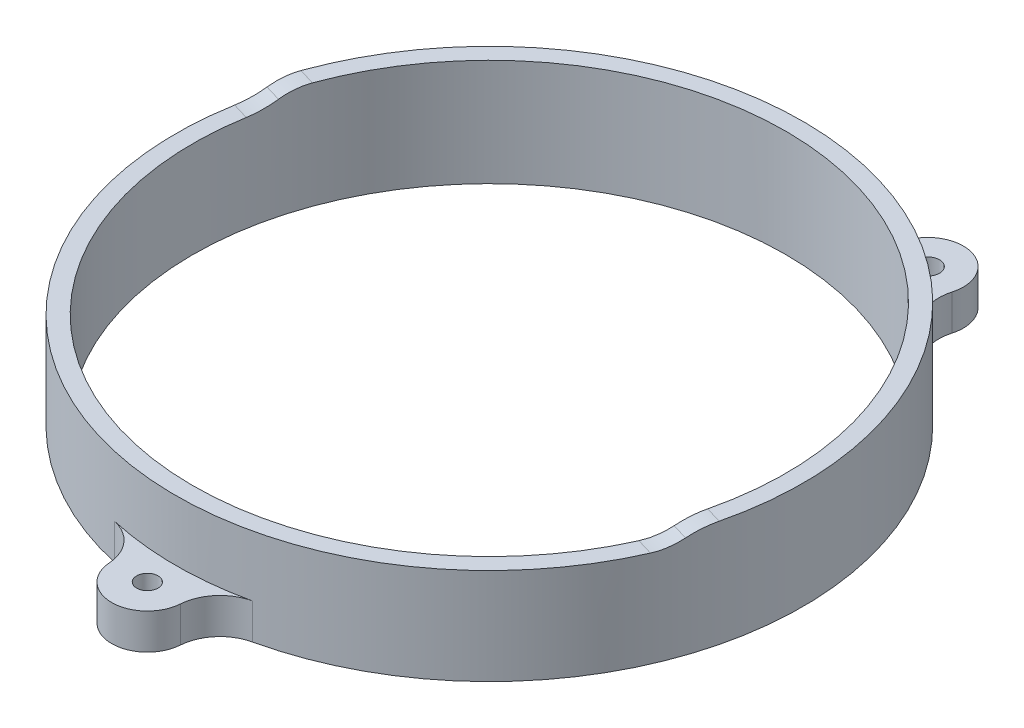
ISO-10303-21;
HEADER;
FILE_DESCRIPTION(('STEP AP214'),'2;1');
FILE_NAME('part.step','',(''),(''),'','','');
FILE_SCHEMA(('AUTOMOTIVE_DESIGN { 1 0 10303 214 1 1 1 1 }'));
ENDSEC;
DATA;
#1=APPLICATION_CONTEXT('core data for automotive mechanical design processes');
#2=APPLICATION_PROTOCOL_DEFINITION('international standard','automotive_design',2000,#1);
#3=PRODUCT_CONTEXT('',#1,'mechanical');
#4=PRODUCT('Part','Part','',(#3));
#5=PRODUCT_RELATED_PRODUCT_CATEGORY('part','',(#4));
#6=PRODUCT_DEFINITION_FORMATION('','',#4);
#7=PRODUCT_DEFINITION_CONTEXT('part definition',#1,'design');
#8=PRODUCT_DEFINITION('design','',#6,#7);
#9=PRODUCT_DEFINITION_SHAPE('','',#8);
#10=(LENGTH_UNIT() NAMED_UNIT(*) SI_UNIT(.MILLI.,.METRE.));
#11=(NAMED_UNIT(*) PLANE_ANGLE_UNIT() SI_UNIT($,.RADIAN.));
#12=(NAMED_UNIT(*) SI_UNIT($,.STERADIAN.) SOLID_ANGLE_UNIT());
#13=UNCERTAINTY_MEASURE_WITH_UNIT(LENGTH_MEASURE(1.E-05),#10,'distance_accuracy_value','');
#14=(GEOMETRIC_REPRESENTATION_CONTEXT(3) GLOBAL_UNCERTAINTY_ASSIGNED_CONTEXT((#13)) GLOBAL_UNIT_ASSIGNED_CONTEXT((#10,
#11,#12)) REPRESENTATION_CONTEXT('',''));
#15=CARTESIAN_POINT('',(0.,0.,0.));
#16=DIRECTION('',(0.,0.,1.));
#17=DIRECTION('',(1.,0.,0.));
#18=AXIS2_PLACEMENT_3D('',#15,#16,#17);
#19=CARTESIAN_POINT('',(0.,15.,0.));
#20=DIRECTION('',(0.,1.,0.));
#21=DIRECTION('',(0.,0.,1.));
#22=AXIS2_PLACEMENT_3D('',#19,#20,#21);
#23=PLANE('',#22);
#24=CARTESIAN_POINT('',(0.,15.,0.));
#25=DIRECTION('',(0.,1.,0.));
#26=DIRECTION('',(0.,0.,1.));
#27=AXIS2_PLACEMENT_3D('',#24,#25,#26);
#28=CIRCLE('',#27,41.6);
#29=CARTESIAN_POINT('',(40.4323625914563,15.,9.78693288385107));
#30=VERTEX_POINT('',#29);
#31=CARTESIAN_POINT('',(-39.0830403842533,15.,-14.2504720736833));
#32=VERTEX_POINT('',#31);
#33=EDGE_CURVE('E209',#30,#32,#28,.T.);
#34=ORIENTED_EDGE('',*,*,#33,.F.);
#35=DIRECTION('',(-0.957218548080887,0.,-0.289365946873363));
#36=VECTOR('',#35,1.);
#37=CARTESIAN_POINT('',(42.7922772191605,15.,10.5003320675119));
#38=LINE('',#37,#36);
#39=CARTESIAN_POINT('',(42.7331060550355,15.,10.4824447000252));
#40=VERTEX_POINT('',#39);
#41=EDGE_CURVE('E614',#30,#40,#38,.F.);
#42=ORIENTED_EDGE('',*,*,#41,.T.);
#43=CARTESIAN_POINT('',(0.,15.,0.));
#44=DIRECTION('',(0.,1.,0.));
#45=DIRECTION('',(0.,0.,1.));
#46=AXIS2_PLACEMENT_3D('',#43,#44,#45);
#47=CIRCLE('',#46,44.);
#48=CARTESIAN_POINT('',(-41.3837838478325,15.,-14.9459838898574));
#49=VERTEX_POINT('',#48);
#50=EDGE_CURVE('E202',#40,#49,#47,.T.);
#51=ORIENTED_EDGE('',*,*,#50,.T.);
#52=DIRECTION('',(-0.957218548080886,0.,-0.289365946873368));
#53=VECTOR('',#52,1.);
#54=CARTESIAN_POINT('',(-39.1456304965634,15.,-14.2693929848481));
#55=LINE('',#54,#53);
#56=EDGE_CURVE('E610',#49,#32,#55,.F.);
#57=ORIENTED_EDGE('',*,*,#56,.T.);
#58=EDGE_LOOP('',(#34,#42,#51,#57));
#59=FACE_BOUND('',#58,.T.);
#60=ADVANCED_FACE('F44',(#59),#23,.T.);
#61=CARTESIAN_POINT('',(0.,0.,0.));
#62=DIRECTION('',(0.,1.,0.));
#63=DIRECTION('',(0.,0.,1.));
#64=AXIS2_PLACEMENT_3D('',#61,#62,#63);
#65=PLANE('',#64);
#66=CARTESIAN_POINT('',(0.,0.,0.));
#67=DIRECTION('',(0.,1.,0.));
#68=DIRECTION('',(0.,0.,1.));
#69=AXIS2_PLACEMENT_3D('',#66,#67,#68);
#70=CIRCLE('',#69,44.);
#71=CARTESIAN_POINT('',(5.6088158517857,0.,-43.6410493084293));
#72=VERTEX_POINT('',#71);
#73=CARTESIAN_POINT('',(-5.60881585178569,0.,-43.6410493084293));
#74=VERTEX_POINT('',#73);
#75=EDGE_CURVE('E203',#72,#74,#70,.T.);
#76=ORIENTED_EDGE('',*,*,#75,.F.);
#77=CARTESIAN_POINT('',(6.3736543770292,0.,-49.5921014868515));
#78=DIRECTION('',(0.,1.,0.));
#79=DIRECTION('',(0.,0.,1.));
#80=AXIS2_PLACEMENT_3D('',#77,#78,#79);
#81=CIRCLE('',#80,6.);
#82=CARTESIAN_POINT('',(11.8518248329944,0.,-47.1447256564181));
#83=VERTEX_POINT('',#82);
#84=EDGE_CURVE('E650',#72,#83,#81,.T.);
#85=ORIENTED_EDGE('',*,*,#84,.T.);
#86=CARTESIAN_POINT('',(16.4169668796321,0.,-45.1052457977236));
#87=DIRECTION('',(0.,-1.,0.));
#88=DIRECTION('',(0.,0.,1.));
#89=AXIS2_PLACEMENT_3D('',#86,#87,#88);
#90=CIRCLE('',#89,5.);
#91=CARTESIAN_POINT('',(21.2250209598818,0.,-43.7331612662918));
#92=VERTEX_POINT('',#91);
#93=EDGE_CURVE('E249',#83,#92,#90,.T.);
#94=ORIENTED_EDGE('',*,*,#93,.T.);
#95=CARTESIAN_POINT('',(26.9946858561814,0.,-42.0866598285737));
#96=DIRECTION('',(0.,1.,0.));
#97=DIRECTION('',(0.,0.,1.));
#98=AXIS2_PLACEMENT_3D('',#95,#96,#97);
#99=CIRCLE('',#98,6.);
#100=CARTESIAN_POINT('',(23.7553235534397,0.,-37.0362606491448));
#101=VERTEX_POINT('',#100);
#102=EDGE_CURVE('E201',#92,#101,#99,.T.);
#103=ORIENTED_EDGE('',*,*,#102,.T.);
#104=CARTESIAN_POINT('',(9.65555507208155,0.,42.9275));
#105=VERTEX_POINT('',#104);
#106=EDGE_CURVE('E188',#105,#101,#70,.T.);
#107=ORIENTED_EDGE('',*,*,#106,.F.);
#108=CARTESIAN_POINT('',(10.9722216728199,0.,48.78125));
#109=DIRECTION('',(0.,1.,0.));
#110=DIRECTION('',(0.,0.,1.));
#111=AXIS2_PLACEMENT_3D('',#108,#109,#110);
#112=CIRCLE('',#111,6.);
#113=CARTESIAN_POINT('',(4.98737348764544,0.,48.3551136363636));
#114=VERTEX_POINT('',#113);
#115=EDGE_CURVE('E170',#105,#114,#112,.T.);
#116=ORIENTED_EDGE('',*,*,#115,.T.);
#117=CARTESIAN_POINT('',(0.,0.,48.));
#118=DIRECTION('',(0.,-1.,0.));
#119=DIRECTION('',(0.,0.,-1.));
#120=AXIS2_PLACEMENT_3D('',#117,#118,#119);
#121=CIRCLE('',#120,5.);
#122=CARTESIAN_POINT('',(-4.98737348764544,0.,48.3551136363636));
#123=VERTEX_POINT('',#122);
#124=EDGE_CURVE('E223',#114,#123,#121,.T.);
#125=ORIENTED_EDGE('',*,*,#124,.T.);
#126=CARTESIAN_POINT('',(-10.9722216728199,0.,48.78125));
#127=DIRECTION('',(0.,1.,0.));
#128=DIRECTION('',(0.,0.,1.));
#129=AXIS2_PLACEMENT_3D('',#126,#127,#128);
#130=CIRCLE('',#129,6.);
#131=CARTESIAN_POINT('',(-9.65555507208155,0.,42.9275));
#132=VERTEX_POINT('',#131);
#133=EDGE_CURVE('E181',#123,#132,#130,.T.);
#134=ORIENTED_EDGE('',*,*,#133,.T.);
#135=CARTESIAN_POINT('',(-23.7553235534396,0.,-37.0362606491448));
#136=VERTEX_POINT('',#135);
#137=EDGE_CURVE('E205',#136,#132,#70,.T.);
#138=ORIENTED_EDGE('',*,*,#137,.F.);
#139=CARTESIAN_POINT('',(-26.9946858561814,0.,-42.0866598285737));
#140=DIRECTION('',(0.,1.,0.));
#141=DIRECTION('',(0.,0.,1.));
#142=AXIS2_PLACEMENT_3D('',#139,#140,#141);
#143=CIRCLE('',#142,6.);
#144=CARTESIAN_POINT('',(-21.2250209598818,0.,-43.7331612662918));
#145=VERTEX_POINT('',#144);
#146=EDGE_CURVE('E655',#136,#145,#143,.T.);
#147=ORIENTED_EDGE('',*,*,#146,.T.);
#148=CARTESIAN_POINT('',(-16.4169668796321,0.,-45.1052457977236));
#149=DIRECTION('',(0.,-1.,0.));
#150=DIRECTION('',(0.,0.,-1.));
#151=AXIS2_PLACEMENT_3D('',#148,#149,#150);
#152=CIRCLE('',#151,5.);
#153=CARTESIAN_POINT('',(-11.8518248329944,0.,-47.1447256564181));
#154=VERTEX_POINT('',#153);
#155=EDGE_CURVE('E237',#145,#154,#152,.T.);
#156=ORIENTED_EDGE('',*,*,#155,.T.);
#157=CARTESIAN_POINT('',(-6.37365437702919,0.,-49.5921014868515));
#158=DIRECTION('',(0.,1.,0.));
#159=DIRECTION('',(0.,0.,1.));
#160=AXIS2_PLACEMENT_3D('',#157,#158,#159);
#161=CIRCLE('',#160,6.);
#162=EDGE_CURVE('E657',#154,#74,#161,.T.);
#163=ORIENTED_EDGE('',*,*,#162,.T.);
#164=EDGE_LOOP('',(#76,#85,#94,#103,#107,#116,#125,#134,#138,#147,#156,#163));
#165=FACE_BOUND('',#164,.T.);
#166=CARTESIAN_POINT('',(0.,0.,0.));
#167=DIRECTION('',(0.,1.,0.));
#168=DIRECTION('',(0.,0.,1.));
#169=AXIS2_PLACEMENT_3D('',#166,#167,#168);
#170=CIRCLE('',#169,41.6);
#171=CARTESIAN_POINT('',(0.,0.,41.6));
#172=VERTEX_POINT('',#171);
#173=EDGE_CURVE('E214',#172,#172,#170,.T.);
#174=ORIENTED_EDGE('',*,*,#173,.T.);
#175=EDGE_LOOP('',(#174));
#176=FACE_BOUND('',#175,.T.);
#177=CARTESIAN_POINT('',(0.,0.,48.));
#178=DIRECTION('',(0.,-1.,0.));
#179=DIRECTION('',(0.,0.,-1.));
#180=AXIS2_PLACEMENT_3D('',#177,#178,#179);
#181=CIRCLE('',#180,1.5);
#182=CARTESIAN_POINT('',(0.,0.,46.5));
#183=VERTEX_POINT('',#182);
#184=EDGE_CURVE('E228',#183,#183,#181,.T.);
#185=ORIENTED_EDGE('',*,*,#184,.F.);
#186=EDGE_LOOP('',(#185));
#187=FACE_BOUND('',#186,.T.);
#188=CARTESIAN_POINT('',(-16.4169668796321,0.,-45.1052457977236));
#189=DIRECTION('',(0.,-1.,0.));
#190=DIRECTION('',(0.,0.,-1.));
#191=AXIS2_PLACEMENT_3D('',#188,#189,#190);
#192=CIRCLE('',#191,1.65);
#193=CARTESIAN_POINT('',(-16.4169668796321,0.,-46.7552457977236));
#194=VERTEX_POINT('',#193);
#195=EDGE_CURVE('E231',#194,#194,#192,.T.);
#196=ORIENTED_EDGE('',*,*,#195,.F.);
#197=EDGE_LOOP('',(#196));
#198=FACE_BOUND('',#197,.T.);
#199=CARTESIAN_POINT('',(16.4169668796321,0.,-45.1052457977236));
#200=DIRECTION('',(0.,-1.,0.));
#201=DIRECTION('',(0.,0.,1.));
#202=AXIS2_PLACEMENT_3D('',#199,#200,#201);
#203=CIRCLE('',#202,1.65);
#204=CARTESIAN_POINT('',(16.4169668796321,0.,-43.4552457977236));
#205=VERTEX_POINT('',#204);
#206=EDGE_CURVE('E243',#205,#205,#203,.T.);
#207=ORIENTED_EDGE('',*,*,#206,.F.);
#208=EDGE_LOOP('',(#207));
#209=FACE_BOUND('',#208,.T.);
#210=ADVANCED_FACE('F197',(#165,#176,#187,#198,#209),#65,.F.);
#211=CARTESIAN_POINT('',(0.,15.,0.));
#212=DIRECTION('',(0.,-1.,0.));
#213=DIRECTION('',(0.,0.,-1.));
#214=AXIS2_PLACEMENT_3D('',#211,#212,#213);
#215=CYLINDRICAL_SURFACE('',#214,44.);
#216=ORIENTED_EDGE('',*,*,#75,.T.);
#217=DIRECTION('',(0.,-1.,0.));
#218=VECTOR('',#217,1.);
#219=CARTESIAN_POINT('',(-5.60881585178569,15.,-43.6410493084293));
#220=LINE('',#219,#218);
#221=CARTESIAN_POINT('',(-5.60881585178569,5.,-43.6410493084293));
#222=VERTEX_POINT('',#221);
#223=EDGE_CURVE('E671',#74,#222,#220,.F.);
#224=ORIENTED_EDGE('',*,*,#223,.T.);
#225=CARTESIAN_POINT('',(0.,5.,0.));
#226=DIRECTION('',(0.,-1.,0.));
#227=DIRECTION('',(0.,0.,-1.));
#228=AXIS2_PLACEMENT_3D('',#225,#226,#227);
#229=CIRCLE('',#228,44.);
#230=CARTESIAN_POINT('',(-23.7553235534396,5.,-37.0362606491448));
#231=VERTEX_POINT('',#230);
#232=EDGE_CURVE('E683',#231,#222,#229,.T.);
#233=ORIENTED_EDGE('',*,*,#232,.F.);
#234=DIRECTION('',(0.,-1.,0.));
#235=VECTOR('',#234,1.);
#236=CARTESIAN_POINT('',(-23.7553235534396,15.,-37.0362606491448));
#237=LINE('',#236,#235);
#238=EDGE_CURVE('E674',#231,#136,#237,.T.);
#239=ORIENTED_EDGE('',*,*,#238,.T.);
#240=ORIENTED_EDGE('',*,*,#137,.T.);
#241=DIRECTION('',(0.,-1.,0.));
#242=VECTOR('',#241,1.);
#243=CARTESIAN_POINT('',(-9.65555507208155,15.,42.9275));
#244=LINE('',#243,#242);
#245=CARTESIAN_POINT('',(-9.65555507208155,5.,42.9275));
#246=VERTEX_POINT('',#245);
#247=EDGE_CURVE('E193',#132,#246,#244,.F.);
#248=ORIENTED_EDGE('',*,*,#247,.T.);
#249=CARTESIAN_POINT('',(0.,5.,0.));
#250=DIRECTION('',(0.,-1.,0.));
#251=DIRECTION('',(0.,0.,-1.));
#252=AXIS2_PLACEMENT_3D('',#249,#250,#251);
#253=CIRCLE('',#252,44.);
#254=CARTESIAN_POINT('',(9.65555507208155,5.,42.9275));
#255=VERTEX_POINT('',#254);
#256=EDGE_CURVE('E191',#255,#246,#253,.T.);
#257=ORIENTED_EDGE('',*,*,#256,.F.);
#258=DIRECTION('',(0.,-1.,0.));
#259=VECTOR('',#258,1.);
#260=CARTESIAN_POINT('',(9.65555507208155,15.,42.9275));
#261=LINE('',#260,#259);
#262=EDGE_CURVE('E174',#255,#105,#261,.T.);
#263=ORIENTED_EDGE('',*,*,#262,.T.);
#264=ORIENTED_EDGE('',*,*,#106,.T.);
#265=DIRECTION('',(0.,-1.,0.));
#266=VECTOR('',#265,1.);
#267=CARTESIAN_POINT('',(23.7553235534397,15.,-37.0362606491448));
#268=LINE('',#267,#266);
#269=CARTESIAN_POINT('',(23.7553235534397,5.,-37.0362606491448));
#270=VERTEX_POINT('',#269);
#271=EDGE_CURVE('E679',#101,#270,#268,.F.);
#272=ORIENTED_EDGE('',*,*,#271,.T.);
#273=CARTESIAN_POINT('',(0.,5.,0.));
#274=DIRECTION('',(0.,1.,0.));
#275=DIRECTION('',(0.,0.,1.));
#276=AXIS2_PLACEMENT_3D('',#273,#274,#275);
#277=CIRCLE('',#276,44.);
#278=CARTESIAN_POINT('',(5.6088158517857,5.,-43.6410493084293));
#279=VERTEX_POINT('',#278);
#280=EDGE_CURVE('E194',#270,#279,#277,.T.);
#281=ORIENTED_EDGE('',*,*,#280,.T.);
#282=DIRECTION('',(0.,-1.,0.));
#283=VECTOR('',#282,1.);
#284=CARTESIAN_POINT('',(5.6088158517857,15.,-43.6410493084293));
#285=LINE('',#284,#283);
#286=EDGE_CURVE('E676',#279,#72,#285,.T.);
#287=ORIENTED_EDGE('',*,*,#286,.T.);
#288=EDGE_LOOP('',(#216,#224,#233,#239,#240,#248,#257,#263,#264,#272,#281,#287));
#289=FACE_BOUND('',#288,.T.);
#290=ORIENTED_EDGE('',*,*,#50,.F.);
#291=CARTESIAN_POINT('',(42.7331060550355,15.,10.4824447000252));
#292=CARTESIAN_POINT('',(42.6942088535455,15.0000008063292,10.6410221926957));
#293=CARTESIAN_POINT('',(42.6544309172247,14.9960115484816,10.7993581497634));
#294=CARTESIAN_POINT('',(42.573218034777,14.9800584904813,11.1151998908344));
#295=CARTESIAN_POINT('',(42.5317831008079,14.9680947488287,11.2727056809192));
#296=CARTESIAN_POINT('',(42.4060052107716,14.920573726307,11.7402763021795));
#297=CARTESIAN_POINT('',(42.319395284413,14.8733847978836,12.0486261701908));
#298=CARTESIAN_POINT('',(42.1412754179379,14.7481871065044,12.6575492624545));
#299=CARTESIAN_POINT('',(42.0497655271704,14.6701786538907,12.9581225649818));
#300=CARTESIAN_POINT('',(41.9094184083451,14.5302199898787,13.4024311017975));
#301=CARTESIAN_POINT('',(41.8618743545893,14.4794272232493,13.5501710272501));
#302=CARTESIAN_POINT('',(41.7660832898898,14.3703221745236,13.8426145232068));
#303=CARTESIAN_POINT('',(41.7178362824715,14.3120099301261,13.9873181089293));
#304=CARTESIAN_POINT('',(41.6693290664663,14.25,14.1303579271916));
#305=B_SPLINE_CURVE_WITH_KNOTS('',3,(#291,#292,#293,#294,#295,#296,#297,#298,#299,#300,#301,
#302,#303,#304),.UNSPECIFIED.,.F.,.F.,(4,2,2,2,2,2,4),(0.,0.489734084874695,0.979464577133454,
1.94898746623233,2.91850059281259,3.40822752620358,3.89795200445229),.UNSPECIFIED.);
#306=CARTESIAN_POINT('',(41.6693290664663,14.25,14.1303579271916));
#307=VERTEX_POINT('',#306);
#308=EDGE_CURVE('E53',#40,#307,#305,.T.);
#309=ORIENTED_EDGE('',*,*,#308,.T.);
#310=CARTESIAN_POINT('',(42.117616115559,15.,12.732101662428));
#311=CARTESIAN_POINT('',(42.048956776923,14.8528759613881,12.959285089304));
#312=CARTESIAN_POINT('',(41.9766342890512,14.7157482619602,13.1918345195883));
#313=CARTESIAN_POINT('',(41.8247198428128,14.4623214797775,13.6658095609761));
#314=CARTESIAN_POINT('',(41.7451263453233,14.3460268224465,13.9072370448886));
#315=CARTESIAN_POINT('',(41.580696282129,14.1376245049208,14.391302076089));
#316=CARTESIAN_POINT('',(41.496025323137,14.0450159352269,14.6337800363336));
#317=CARTESIAN_POINT('',(41.3201052498318,13.8811499763699,15.1233790501913));
#318=CARTESIAN_POINT('',(41.2288582178236,13.8098858650433,15.3704986158794));
#319=CARTESIAN_POINT('',(41.0057663716303,13.6671732672236,15.9580133093175));
#320=CARTESIAN_POINT('',(40.871205632448,13.6050433069707,16.2997130308723));
#321=CARTESIAN_POINT('',(40.6605239921255,13.5422708017593,16.8153853662375));
#322=CARTESIAN_POINT('',(40.5882006524822,13.5264159871252,16.9892174253246));
#323=CARTESIAN_POINT('',(40.4410804227213,13.5052804069235,17.336510657882));
#324=CARTESIAN_POINT('',(40.3662831376778,13.5000013379671,17.5099717673848));
#325=CARTESIAN_POINT('',(40.2903467583911,13.5,17.6829849880783));
#326=B_SPLINE_CURVE_WITH_KNOTS('',3,(#310,#311,#312,#313,#314,#315,#316,#317,#318,#319,#320,
#321,#322,#323,#324,#325),.UNSPECIFIED.,.F.,.F.,(4,2,2,2,2,2,2,4),(0.,0.837451253552979,
1.6750801908703,2.49317060489567,3.31100310026343,4.42563031455076,4.99219790249612,
5.55885637462049),.UNSPECIFIED.);
#327=CARTESIAN_POINT('',(40.2903467583911,13.5,17.6829849880783));
#328=VERTEX_POINT('',#327);
#329=EDGE_CURVE('E275',#307,#328,#326,.T.);
#330=ORIENTED_EDGE('',*,*,#329,.T.);
#331=CARTESIAN_POINT('',(0.,13.5,0.));
#332=DIRECTION('',(0.,1.,0.));
#333=DIRECTION('',(0.,0.,-1.));
#334=AXIS2_PLACEMENT_3D('',#331,#332,#333);
#335=CIRCLE('',#334,44.);
#336=CARTESIAN_POINT('',(-43.3390061825153,13.5,-7.59806179968964));
#337=VERTEX_POINT('',#336);
#338=EDGE_CURVE('E259',#337,#328,#335,.T.);
#339=ORIENTED_EDGE('',*,*,#338,.F.);
#340=CARTESIAN_POINT('',(-43.3390061825153,13.5,-7.59806179968964));
#341=CARTESIAN_POINT('',(-43.2908147586386,13.4999635265211,-7.8730993235867));
#342=CARTESIAN_POINT('',(-43.239951395526,13.5115257757121,-8.14767942430858));
#343=CARTESIAN_POINT('',(-43.1334107753605,13.5577597380435,-8.69400419213102));
#344=CARTESIAN_POINT('',(-43.0777325156923,13.5924362744504,-8.9657482554117));
#345=CARTESIAN_POINT('',(-42.9634607974296,13.6837336717784,-9.49808357157944));
#346=CARTESIAN_POINT('',(-42.9049656015734,13.7398239279831,-9.75878712716097));
#347=CARTESIAN_POINT('',(-42.78458378536,13.873637555721,-10.2737146116634));
#348=CARTESIAN_POINT('',(-42.7226982337045,13.9513541413971,-10.5279405458475));
#349=CARTESIAN_POINT('',(-42.6164272349106,14.0998026876983,-10.9485665797221));
#350=CARTESIAN_POINT('',(-42.5727417472403,14.164883396136,-11.1171637056067));
#351=CARTESIAN_POINT('',(-42.4844084003042,14.3046760518853,-11.4500959591408));
#352=CARTESIAN_POINT('',(-42.4397604216623,14.3793891996817,-11.614430552482));
#353=CARTESIAN_POINT('',(-42.3490625027564,14.5394969241211,-11.9409406842461));
#354=CARTESIAN_POINT('',(-42.3030015712218,14.6250454692212,-12.1030376305262));
#355=CARTESIAN_POINT('',(-42.2105089326213,14.8055432362453,-12.4217771965754));
#356=CARTESIAN_POINT('',(-42.1640772648729,14.900491473172,-12.5784203855254));
#357=CARTESIAN_POINT('',(-42.117616115559,15.,-12.732101662428));
#358=B_SPLINE_CURVE_WITH_KNOTS('',3,(#340,#341,#342,#343,#344,#345,#346,#347,#348,#349,#350,
#351,#352,#353,#354,#355,#356,#357),.UNSPECIFIED.,.F.,.F.,(4,2,2,2,2,2,2,2,4),(0.,
0.837449239874748,1.67507328530952,2.49316375344331,3.3109978120263,3.86850352943473,
4.42607879570873,4.99272305051489,5.55930798918881),.UNSPECIFIED.);
#359=CARTESIAN_POINT('',(-42.5189976749269,14.25,-11.3196659279134));
#360=VERTEX_POINT('',#359);
#361=EDGE_CURVE('E280',#337,#360,#358,.T.);
#362=ORIENTED_EDGE('',*,*,#361,.T.);
#363=CARTESIAN_POINT('',(-42.5189976749269,14.25,-11.3196659279134));
#364=CARTESIAN_POINT('',(-42.4801414319583,14.3120099301261,-11.465623223022));
#365=CARTESIAN_POINT('',(-42.4401468742225,14.3703221745236,-11.6128215137638));
#366=CARTESIAN_POINT('',(-42.3578904868667,14.4794272232493,-11.9093565254281));
#367=CARTESIAN_POINT('',(-42.3156286458811,14.5302199898787,-12.0586932570677));
#368=CARTESIAN_POINT('',(-42.1863376020143,14.6701786538907,-12.5063440312497));
#369=CARTESIAN_POINT('',(-42.0960132962665,14.7481871065044,-12.8072757346172));
#370=CARTESIAN_POINT('',(-41.9069773722736,14.8733847978836,-13.4128989166084));
#371=CARTESIAN_POINT('',(-41.8082656695815,14.920573726307,-13.7175904330608));
#372=CARTESIAN_POINT('',(-41.6539586727798,14.9680947488287,-14.1765367417133));
#373=CARTESIAN_POINT('',(-41.601200753219,14.9800584904813,-14.3306196076877));
#374=CARTESIAN_POINT('',(-41.4938455295384,14.9960115484816,-14.6385585523288));
#375=CARTESIAN_POINT('',(-41.439248211928,15.0000008063292,-14.7924146293236));
#376=CARTESIAN_POINT('',(-41.3837838478325,15.,-14.9459838898574));
#377=B_SPLINE_CURVE_WITH_KNOTS('',3,(#363,#364,#365,#366,#367,#368,#369,#370,#371,#372,#373,
#374,#375,#376),.UNSPECIFIED.,.F.,.F.,(4,2,2,2,2,2,4),(0.,0.489724478248714,0.979451411639706,
1.94896453821996,2.91848742731884,3.4082179195776,3.89795200445229),.UNSPECIFIED.);
#378=EDGE_CURVE('E60',#360,#49,#377,.T.);
#379=ORIENTED_EDGE('',*,*,#378,.T.);
#380=EDGE_LOOP('',(#290,#309,#330,#339,#362,#379));
#381=FACE_BOUND('',#380,.T.);
#382=ADVANCED_FACE('F186',(#289,#381),#215,.T.);
#383=CARTESIAN_POINT('',(0.,15.,0.));
#384=DIRECTION('',(0.,-1.,0.));
#385=DIRECTION('',(0.,0.,-1.));
#386=AXIS2_PLACEMENT_3D('',#383,#384,#385);
#387=CYLINDRICAL_SURFACE('',#386,41.6);
#388=CARTESIAN_POINT('',(37.9754070490005,13.5,16.983181664892));
#389=CARTESIAN_POINT('',(38.0891861137236,13.4999631726032,16.7288340399084));
#390=CARTESIAN_POINT('',(38.2003639100558,13.5114572063766,16.4733100931118));
#391=CARTESIAN_POINT('',(38.4168908793039,13.5574345246558,15.9617984820581));
#392=CARTESIAN_POINT('',(38.5222388270816,13.5919226216269,15.7058107319181));
#393=CARTESIAN_POINT('',(38.7240444085909,13.6827411366399,15.201336643241));
#394=CARTESIAN_POINT('',(38.820652327761,13.7385419365464,14.9528148685031));
#395=CARTESIAN_POINT('',(39.0072168062379,13.8716853041208,14.4591348477629));
#396=CARTESIAN_POINT('',(39.0971754315278,13.9490211447922,14.2139755764524));
#397=CARTESIAN_POINT('',(39.2429612910812,14.0971162247327,13.8051157443493));
#398=CARTESIAN_POINT('',(39.3006302838226,14.1623043695451,13.640028119119));
#399=CARTESIAN_POINT('',(39.4126654618681,14.3023890172168,13.3128394991796));
#400=CARTESIAN_POINT('',(39.4670312205808,14.3772867701121,13.1507388921001));
#401=CARTESIAN_POINT('',(39.5732784827654,14.5378530921177,12.8275106483285));
#402=CARTESIAN_POINT('',(39.6251045885799,14.6236782236763,12.6664426165429));
#403=CARTESIAN_POINT('',(39.7252933411574,14.8048042596015,12.3486398014372));
#404=CARTESIAN_POINT('',(39.7736563666127,14.9001041251635,12.1919045454769));
#405=CARTESIAN_POINT('',(39.8202916001649,15.,12.037623389932));
#406=B_SPLINE_CURVE_WITH_KNOTS('',3,(#388,#389,#390,#391,#392,#393,#394,#395,#396,#397,#398,
#399,#400,#401,#402,#403,#404,#405),.UNSPECIFIED.,.F.,.F.,(4,2,2,2,2,2,2,2,4),(0.,
0.835678700071165,1.67153235563778,2.4878404516243,3.30389383931728,3.8634900171463,
4.42315831028216,4.99200957704288,5.56079854389996),.UNSPECIFIED.);
#407=CARTESIAN_POINT('',(37.9754070490005,13.5,16.983181664892));
#408=VERTEX_POINT('',#407);
#409=CARTESIAN_POINT('',(39.3706506877064,14.25,13.4354703835259));
#410=VERTEX_POINT('',#409);
#411=EDGE_CURVE('E278',#408,#410,#406,.T.);
#412=ORIENTED_EDGE('',*,*,#411,.T.);
#413=CARTESIAN_POINT('',(39.3706506877064,14.25,13.4354703835259));
#414=CARTESIAN_POINT('',(39.4194370700335,14.3120105139887,13.2925135418213));
#415=CARTESIAN_POINT('',(39.4679235532586,14.3703242345661,13.1478783000868));
#416=CARTESIAN_POINT('',(39.5641089188648,14.4794331034496,12.8555415389519));
#417=CARTESIAN_POINT('',(39.6118077960315,14.530228201997,12.7078399992659));
#418=CARTESIAN_POINT('',(39.7524768918365,14.6701883263454,12.2636171167976));
#419=CARTESIAN_POINT('',(39.8440226635705,14.7481971927852,11.9630476280365));
#420=CARTESIAN_POINT('',(40.0218289355619,14.8733931449322,11.3540222638884));
#421=CARTESIAN_POINT('',(40.1080893762695,14.9205798834244,11.0455662996999));
#422=CARTESIAN_POINT('',(40.2330401790216,14.9680980399372,10.5777572734058));
#423=CARTESIAN_POINT('',(40.2741475466402,14.9800608884174,10.4201538141561));
#424=CARTESIAN_POINT('',(40.3546017379627,14.9960123249496,10.1040949857641));
#425=CARTESIAN_POINT('',(40.393948548989,15.0000008555885,9.94563961049644));
#426=CARTESIAN_POINT('',(40.4323625914563,15.,9.78693288385107));
#427=B_SPLINE_CURVE_WITH_KNOTS('',3,(#413,#414,#415,#416,#417,#418,#419,#420,#421,#422,#423,
#424,#425,#426),.UNSPECIFIED.,.F.,.F.,(4,2,2,2,2,2,4),(0.,0.489756370737445,0.979515982572471,
1.94904044729476,2.91857583364086,3.40833942705426,3.89810654663618),.UNSPECIFIED.);
#428=EDGE_CURVE('E332',#410,#30,#427,.T.);
#429=ORIENTED_EDGE('',*,*,#428,.T.);
#430=ORIENTED_EDGE('',*,*,#33,.T.);
#431=CARTESIAN_POINT('',(-39.0830403842533,15.,-14.2504720736833));
#432=CARTESIAN_POINT('',(-39.1389785871199,15.0000008555885,-14.0970628783878));
#433=CARTESIAN_POINT('',(-39.1940009859439,14.9960123249496,-13.9433462133289));
#434=CARTESIAN_POINT('',(-39.3021081068043,14.9800608884174,-13.6356468302857));
#435=CARTESIAN_POINT('',(-39.3551928427885,14.9680980399372,-13.4816641142248));
#436=CARTESIAN_POINT('',(-39.510320488381,14.9205798834244,-13.0229775090536));
#437=CARTESIAN_POINT('',(-39.6093819244111,14.8733931449322,-12.718391269433));
#438=CARTESIAN_POINT('',(-39.7987355825454,14.7481971927852,-12.1128566653959));
#439=CARTESIAN_POINT('',(-39.8890279034204,14.6701883263454,-11.811908260038));
#440=CARTESIAN_POINT('',(-40.0180034400923,14.530228201997,-11.3641504295501));
#441=CARTESIAN_POINT('',(-40.0601151205417,14.4794331034496,-11.2147598874188));
#442=CARTESIAN_POINT('',(-40.1419841105123,14.3703242345661,-10.918095304179));
#443=CARTESIAN_POINT('',(-40.1817414356123,14.3120105139887,-10.7708212490707));
#444=CARTESIAN_POINT('',(-40.220319296167,14.25,-10.6247783842476));
#445=B_SPLINE_CURVE_WITH_KNOTS('',3,(#431,#432,#433,#434,#435,#436,#437,#438,#439,#440,#441,
#442,#443,#444),.UNSPECIFIED.,.F.,.F.,(4,2,2,2,2,2,4),(0.,0.489767119581924,0.979530712995321,
1.94906609934143,2.91859056406371,3.40835017589873,3.89810654663618),.UNSPECIFIED.);
#446=CARTESIAN_POINT('',(-40.220319296167,14.25,-10.6247783842476));
#447=VERTEX_POINT('',#446);
#448=EDGE_CURVE('E326',#32,#447,#445,.T.);
#449=ORIENTED_EDGE('',*,*,#448,.T.);
#450=CARTESIAN_POINT('',(-39.8202916001649,15.,-12.037623389932));
#451=CARTESIAN_POINT('',(-39.8888392631581,14.8531869181402,-11.8109308816635));
#452=CARTESIAN_POINT('',(-39.9572031597024,14.7163281960959,-11.5777357110879));
#453=CARTESIAN_POINT('',(-40.0925595903126,14.4633521353154,-11.0999071020542));
#454=CARTESIAN_POINT('',(-40.1595518290337,14.3472392228262,-10.8552712366673));
#455=CARTESIAN_POINT('',(-40.2895921916904,14.1391136159617,-10.3620626992735));
#456=CARTESIAN_POINT('',(-40.3526959177986,14.0466007361263,-10.1137159523142));
#457=CARTESIAN_POINT('',(-40.4757366729404,13.8828326487315,-9.60948066748299));
#458=CARTESIAN_POINT('',(-40.5356746902355,13.8115707744333,-9.35359452256488));
#459=CARTESIAN_POINT('',(-40.6732093095302,13.668256288465,-8.73968234962736));
#460=CARTESIAN_POINT('',(-40.749107441281,13.6057186290556,-8.37898244593346));
#461=CARTESIAN_POINT('',(-40.8568462103458,13.5425385306165,-7.83031227128698));
#462=CARTESIAN_POINT('',(-40.8920024696856,13.5265819031272,-7.64460281609353));
#463=CARTESIAN_POINT('',(-40.9598874545203,13.5053124727538,-7.27210311524247));
#464=CARTESIAN_POINT('',(-40.9926158002505,13.5000013316287,-7.08531270541125));
#465=CARTESIAN_POINT('',(-41.0240664731246,13.5,-6.89825847650333));
#466=B_SPLINE_CURVE_WITH_KNOTS('',3,(#450,#451,#452,#453,#454,#455,#456,#457,#458,#459,#460,
#461,#462,#463,#464,#465),.UNSPECIFIED.,.F.,.F.,(4,2,2,2,2,2,2,4),(0.,0.835680979250788,
1.67154004385434,2.48784810454887,3.30389980788279,4.42270293582856,4.99147688970486,
5.56033962220604),.UNSPECIFIED.);
#467=CARTESIAN_POINT('',(-41.0240664731246,13.5,-6.89825847650333));
#468=VERTEX_POINT('',#467);
#469=EDGE_CURVE('E291',#447,#468,#466,.T.);
#470=ORIENTED_EDGE('',*,*,#469,.T.);
#471=CARTESIAN_POINT('',(0.,13.5,0.));
#472=DIRECTION('',(0.,-1.,0.));
#473=DIRECTION('',(0.,0.,-1.));
#474=AXIS2_PLACEMENT_3D('',#471,#472,#473);
#475=CIRCLE('',#474,41.6);
#476=EDGE_CURVE('E255',#408,#468,#475,.T.);
#477=ORIENTED_EDGE('',*,*,#476,.F.);
#478=EDGE_LOOP('',(#412,#429,#430,#449,#470,#477));
#479=FACE_BOUND('',#478,.T.);
#480=ORIENTED_EDGE('',*,*,#173,.F.);
#481=EDGE_LOOP('',(#480));
#482=FACE_BOUND('',#481,.T.);
#483=ADVANCED_FACE('F338',(#479,#482),#387,.F.);
#484=CARTESIAN_POINT('',(0.,5.,48.));
#485=DIRECTION('',(0.,-1.,0.));
#486=DIRECTION('',(0.,0.,-1.));
#487=AXIS2_PLACEMENT_3D('',#484,#485,#486);
#488=CYLINDRICAL_SURFACE('',#487,5.);
#489=CARTESIAN_POINT('',(0.,5.,48.));
#490=DIRECTION('',(0.,-1.,0.));
#491=DIRECTION('',(0.,0.,-1.));
#492=AXIS2_PLACEMENT_3D('',#489,#490,#491);
#493=CIRCLE('',#492,5.);
#494=CARTESIAN_POINT('',(4.98737348764544,5.,48.3551136363636));
#495=VERTEX_POINT('',#494);
#496=CARTESIAN_POINT('',(-4.98737348764544,5.,48.3551136363636));
#497=VERTEX_POINT('',#496);
#498=EDGE_CURVE('E220',#495,#497,#493,.T.);
#499=ORIENTED_EDGE('',*,*,#498,.T.);
#500=DIRECTION('',(0.,-1.,0.));
#501=VECTOR('',#500,1.);
#502=CARTESIAN_POINT('',(-4.98737348764544,5.,48.3551136363636));
#503=LINE('',#502,#501);
#504=EDGE_CURVE('E639',#497,#123,#503,.T.);
#505=ORIENTED_EDGE('',*,*,#504,.T.);
#506=ORIENTED_EDGE('',*,*,#124,.F.);
#507=DIRECTION('',(0.,-1.,0.));
#508=VECTOR('',#507,1.);
#509=CARTESIAN_POINT('',(4.98737348764544,5.,48.3551136363636));
#510=LINE('',#509,#508);
#511=EDGE_CURVE('E175',#114,#495,#510,.F.);
#512=ORIENTED_EDGE('',*,*,#511,.T.);
#513=EDGE_LOOP('',(#499,#505,#506,#512));
#514=FACE_BOUND('',#513,.T.);
#515=ADVANCED_FACE('F343',(#514),#488,.T.);
#516=CARTESIAN_POINT('',(0.,5.,48.));
#517=DIRECTION('',(0.,-1.,0.));
#518=DIRECTION('',(0.,0.,-1.));
#519=AXIS2_PLACEMENT_3D('',#516,#517,#518);
#520=PLANE('',#519);
#521=CARTESIAN_POINT('',(0.,5.,48.));
#522=DIRECTION('',(0.,-1.,0.));
#523=DIRECTION('',(0.,0.,-1.));
#524=AXIS2_PLACEMENT_3D('',#521,#522,#523);
#525=CIRCLE('',#524,1.5);
#526=CARTESIAN_POINT('',(0.,5.,46.5));
#527=VERTEX_POINT('',#526);
#528=EDGE_CURVE('E225',#527,#527,#525,.T.);
#529=ORIENTED_EDGE('',*,*,#528,.T.);
#530=EDGE_LOOP('',(#529));
#531=FACE_BOUND('',#530,.T.);
#532=ORIENTED_EDGE('',*,*,#498,.F.);
#533=CARTESIAN_POINT('',(10.9722216728199,5.,48.78125));
#534=DIRECTION('',(0.,-1.,0.));
#535=DIRECTION('',(0.,0.,-1.));
#536=AXIS2_PLACEMENT_3D('',#533,#534,#535);
#537=CIRCLE('',#536,6.);
#538=EDGE_CURVE('E180',#495,#255,#537,.T.);
#539=ORIENTED_EDGE('',*,*,#538,.T.);
#540=ORIENTED_EDGE('',*,*,#256,.T.);
#541=CARTESIAN_POINT('',(-10.9722216728199,5.,48.78125));
#542=DIRECTION('',(0.,-1.,0.));
#543=DIRECTION('',(0.,0.,-1.));
#544=AXIS2_PLACEMENT_3D('',#541,#542,#543);
#545=CIRCLE('',#544,6.);
#546=EDGE_CURVE('E640',#246,#497,#545,.T.);
#547=ORIENTED_EDGE('',*,*,#546,.T.);
#548=EDGE_LOOP('',(#532,#539,#540,#547));
#549=FACE_BOUND('',#548,.T.);
#550=ADVANCED_FACE('F368',(#531,#549),#520,.F.);
#551=CARTESIAN_POINT('',(0.,5.,48.));
#552=DIRECTION('',(0.,-1.,0.));
#553=DIRECTION('',(0.,0.,-1.));
#554=AXIS2_PLACEMENT_3D('',#551,#552,#553);
#555=CYLINDRICAL_SURFACE('',#554,1.5);
#556=ORIENTED_EDGE('',*,*,#528,.F.);
#557=EDGE_LOOP('',(#556));
#558=FACE_BOUND('',#557,.T.);
#559=ORIENTED_EDGE('',*,*,#184,.T.);
#560=EDGE_LOOP('',(#559));
#561=FACE_BOUND('',#560,.T.);
#562=ADVANCED_FACE('F375',(#558,#561),#555,.F.);
#563=CARTESIAN_POINT('',(-16.4169668796321,5.,-45.1052457977236));
#564=DIRECTION('',(0.,-1.,0.));
#565=DIRECTION('',(0.,0.,-1.));
#566=AXIS2_PLACEMENT_3D('',#563,#564,#565);
#567=CYLINDRICAL_SURFACE('',#566,5.);
#568=CARTESIAN_POINT('',(-16.4169668796321,5.,-45.1052457977236));
#569=DIRECTION('',(0.,-1.,0.));
#570=DIRECTION('',(0.,0.,-1.));
#571=AXIS2_PLACEMENT_3D('',#568,#569,#570);
#572=CIRCLE('',#571,5.);
#573=CARTESIAN_POINT('',(-21.2250209598818,5.,-43.7331612662918));
#574=VERTEX_POINT('',#573);
#575=CARTESIAN_POINT('',(-11.8518248329944,5.,-47.1447256564181));
#576=VERTEX_POINT('',#575);
#577=EDGE_CURVE('E240',#574,#576,#572,.T.);
#578=ORIENTED_EDGE('',*,*,#577,.T.);
#579=DIRECTION('',(0.,-1.,0.));
#580=VECTOR('',#579,1.);
#581=CARTESIAN_POINT('',(-11.8518248329944,5.,-47.1447256564181));
#582=LINE('',#581,#580);
#583=EDGE_CURVE('E667',#576,#154,#582,.T.);
#584=ORIENTED_EDGE('',*,*,#583,.T.);
#585=ORIENTED_EDGE('',*,*,#155,.F.);
#586=DIRECTION('',(0.,-1.,0.));
#587=VECTOR('',#586,1.);
#588=CARTESIAN_POINT('',(-21.2250209598818,5.,-43.7331612662918));
#589=LINE('',#588,#587);
#590=EDGE_CURVE('E669',#145,#574,#589,.F.);
#591=ORIENTED_EDGE('',*,*,#590,.T.);
#592=EDGE_LOOP('',(#578,#584,#585,#591));
#593=FACE_BOUND('',#592,.T.);
#594=ADVANCED_FACE('F383',(#593),#567,.T.);
#595=CARTESIAN_POINT('',(-16.4169668796321,5.,-45.1052457977236));
#596=DIRECTION('',(0.,-1.,0.));
#597=DIRECTION('',(0.,0.,-1.));
#598=AXIS2_PLACEMENT_3D('',#595,#596,#597);
#599=PLANE('',#598);
#600=CARTESIAN_POINT('',(-16.4169668796321,5.,-45.1052457977236));
#601=DIRECTION('',(0.,-1.,0.));
#602=DIRECTION('',(0.,0.,-1.));
#603=AXIS2_PLACEMENT_3D('',#600,#601,#602);
#604=CIRCLE('',#603,1.65);
#605=CARTESIAN_POINT('',(-16.4169668796321,5.,-46.7552457977236));
#606=VERTEX_POINT('',#605);
#607=EDGE_CURVE('E234',#606,#606,#604,.T.);
#608=ORIENTED_EDGE('',*,*,#607,.T.);
#609=EDGE_LOOP('',(#608));
#610=FACE_BOUND('',#609,.T.);
#611=ORIENTED_EDGE('',*,*,#577,.F.);
#612=CARTESIAN_POINT('',(-26.9946858561814,5.,-42.0866598285737));
#613=DIRECTION('',(0.,-1.,0.));
#614=DIRECTION('',(0.,0.,-1.));
#615=AXIS2_PLACEMENT_3D('',#612,#613,#614);
#616=CIRCLE('',#615,6.);
#617=EDGE_CURVE('E652',#574,#231,#616,.T.);
#618=ORIENTED_EDGE('',*,*,#617,.T.);
#619=ORIENTED_EDGE('',*,*,#232,.T.);
#620=CARTESIAN_POINT('',(-6.37365437702919,5.,-49.5921014868515));
#621=DIRECTION('',(0.,-1.,0.));
#622=DIRECTION('',(0.,0.,-1.));
#623=AXIS2_PLACEMENT_3D('',#620,#621,#622);
#624=CIRCLE('',#623,6.);
#625=EDGE_CURVE('E659',#222,#576,#624,.T.);
#626=ORIENTED_EDGE('',*,*,#625,.T.);
#627=EDGE_LOOP('',(#611,#618,#619,#626));
#628=FACE_BOUND('',#627,.T.);
#629=ADVANCED_FACE('F391',(#610,#628),#599,.F.);
#630=CARTESIAN_POINT('',(-16.4169668796321,5.,-45.1052457977236));
#631=DIRECTION('',(0.,-1.,0.));
#632=DIRECTION('',(0.,0.,-1.));
#633=AXIS2_PLACEMENT_3D('',#630,#631,#632);
#634=CYLINDRICAL_SURFACE('',#633,1.65);
#635=ORIENTED_EDGE('',*,*,#607,.F.);
#636=EDGE_LOOP('',(#635));
#637=FACE_BOUND('',#636,.T.);
#638=ORIENTED_EDGE('',*,*,#195,.T.);
#639=EDGE_LOOP('',(#638));
#640=FACE_BOUND('',#639,.T.);
#641=ADVANCED_FACE('F399',(#637,#640),#634,.F.);
#642=CARTESIAN_POINT('',(16.4169668796321,5.,-45.1052457977236));
#643=DIRECTION('',(0.,-1.,0.));
#644=DIRECTION('',(0.,0.,-1.));
#645=AXIS2_PLACEMENT_3D('',#642,#643,#644);
#646=CYLINDRICAL_SURFACE('',#645,5.);
#647=ORIENTED_EDGE('',*,*,#93,.F.);
#648=DIRECTION('',(0.,-1.,0.));
#649=VECTOR('',#648,1.);
#650=CARTESIAN_POINT('',(11.8518248329944,5.,-47.1447256564181));
#651=LINE('',#650,#649);
#652=CARTESIAN_POINT('',(11.8518248329944,5.,-47.1447256564181));
#653=VERTEX_POINT('',#652);
#654=EDGE_CURVE('E663',#83,#653,#651,.F.);
#655=ORIENTED_EDGE('',*,*,#654,.T.);
#656=CARTESIAN_POINT('',(16.4169668796321,5.,-45.1052457977236));
#657=DIRECTION('',(0.,-1.,0.));
#658=DIRECTION('',(0.,0.,1.));
#659=AXIS2_PLACEMENT_3D('',#656,#657,#658);
#660=CIRCLE('',#659,5.);
#661=CARTESIAN_POINT('',(21.2250209598818,5.,-43.7331612662918));
#662=VERTEX_POINT('',#661);
#663=EDGE_CURVE('E252',#653,#662,#660,.T.);
#664=ORIENTED_EDGE('',*,*,#663,.T.);
#665=DIRECTION('',(0.,-1.,0.));
#666=VECTOR('',#665,1.);
#667=CARTESIAN_POINT('',(21.2250209598818,5.,-43.7331612662918));
#668=LINE('',#667,#666);
#669=EDGE_CURVE('E665',#662,#92,#668,.T.);
#670=ORIENTED_EDGE('',*,*,#669,.T.);
#671=EDGE_LOOP('',(#647,#655,#664,#670));
#672=FACE_BOUND('',#671,.T.);
#673=ADVANCED_FACE('F407',(#672),#646,.T.);
#674=CARTESIAN_POINT('',(16.4169668796321,5.,-45.1052457977236));
#675=DIRECTION('',(0.,1.,0.));
#676=DIRECTION('',(0.,0.,1.));
#677=AXIS2_PLACEMENT_3D('',#674,#675,#676);
#678=PLANE('',#677);
#679=ORIENTED_EDGE('',*,*,#280,.F.);
#680=CARTESIAN_POINT('',(26.9946858561814,5.,-42.0866598285737));
#681=DIRECTION('',(0.,1.,0.));
#682=DIRECTION('',(0.,0.,1.));
#683=AXIS2_PLACEMENT_3D('',#680,#681,#682);
#684=CIRCLE('',#683,6.);
#685=EDGE_CURVE('E645',#270,#662,#684,.F.);
#686=ORIENTED_EDGE('',*,*,#685,.T.);
#687=ORIENTED_EDGE('',*,*,#663,.F.);
#688=CARTESIAN_POINT('',(6.3736543770292,5.,-49.5921014868515));
#689=DIRECTION('',(0.,1.,0.));
#690=DIRECTION('',(0.,0.,1.));
#691=AXIS2_PLACEMENT_3D('',#688,#689,#690);
#692=CIRCLE('',#691,6.);
#693=EDGE_CURVE('E647',#653,#279,#692,.F.);
#694=ORIENTED_EDGE('',*,*,#693,.T.);
#695=EDGE_LOOP('',(#679,#686,#687,#694));
#696=FACE_BOUND('',#695,.T.);
#697=CARTESIAN_POINT('',(16.4169668796321,5.,-45.1052457977236));
#698=DIRECTION('',(0.,-1.,0.));
#699=DIRECTION('',(0.,0.,1.));
#700=AXIS2_PLACEMENT_3D('',#697,#698,#699);
#701=CIRCLE('',#700,1.65);
#702=CARTESIAN_POINT('',(16.4169668796321,5.,-43.4552457977236));
#703=VERTEX_POINT('',#702);
#704=EDGE_CURVE('E246',#703,#703,#701,.T.);
#705=ORIENTED_EDGE('',*,*,#704,.T.);
#706=EDGE_LOOP('',(#705));
#707=FACE_BOUND('',#706,.T.);
#708=ADVANCED_FACE('F415',(#696,#707),#678,.T.);
#709=CARTESIAN_POINT('',(16.4169668796321,5.,-45.1052457977236));
#710=DIRECTION('',(0.,-1.,0.));
#711=DIRECTION('',(0.,0.,-1.));
#712=AXIS2_PLACEMENT_3D('',#709,#710,#711);
#713=CYLINDRICAL_SURFACE('',#712,1.65);
#714=ORIENTED_EDGE('',*,*,#704,.F.);
#715=EDGE_LOOP('',(#714));
#716=FACE_BOUND('',#715,.T.);
#717=ORIENTED_EDGE('',*,*,#206,.T.);
#718=EDGE_LOOP('',(#717));
#719=FACE_BOUND('',#718,.T.);
#720=ADVANCED_FACE('F423',(#716,#719),#713,.F.);
#721=CARTESIAN_POINT('',(-6.37365437702919,5.,-49.5921014868515));
#722=DIRECTION('',(0.,-1.,0.));
#723=DIRECTION('',(0.,0.,-1.));
#724=AXIS2_PLACEMENT_3D('',#721,#722,#723);
#725=CYLINDRICAL_SURFACE('',#724,6.);
#726=ORIENTED_EDGE('',*,*,#162,.F.);
#727=ORIENTED_EDGE('',*,*,#583,.F.);
#728=ORIENTED_EDGE('',*,*,#625,.F.);
#729=ORIENTED_EDGE('',*,*,#223,.F.);
#730=EDGE_LOOP('',(#726,#727,#728,#729));
#731=FACE_BOUND('',#730,.T.);
#732=ADVANCED_FACE('F431',(#731),#725,.F.);
#733=CARTESIAN_POINT('',(-26.9946858561814,5.,-42.0866598285737));
#734=DIRECTION('',(0.,1.,0.));
#735=DIRECTION('',(0.,0.,1.));
#736=AXIS2_PLACEMENT_3D('',#733,#734,#735);
#737=CYLINDRICAL_SURFACE('',#736,6.);
#738=ORIENTED_EDGE('',*,*,#617,.F.);
#739=ORIENTED_EDGE('',*,*,#590,.F.);
#740=ORIENTED_EDGE('',*,*,#146,.F.);
#741=ORIENTED_EDGE('',*,*,#238,.F.);
#742=EDGE_LOOP('',(#738,#739,#740,#741));
#743=FACE_BOUND('',#742,.T.);
#744=ADVANCED_FACE('F438',(#743),#737,.F.);
#745=CARTESIAN_POINT('',(6.3736543770292,5.,-49.5921014868515));
#746=DIRECTION('',(0.,1.,0.));
#747=DIRECTION('',(0.,0.,1.));
#748=AXIS2_PLACEMENT_3D('',#745,#746,#747);
#749=CYLINDRICAL_SURFACE('',#748,6.);
#750=ORIENTED_EDGE('',*,*,#693,.F.);
#751=ORIENTED_EDGE('',*,*,#654,.F.);
#752=ORIENTED_EDGE('',*,*,#84,.F.);
#753=ORIENTED_EDGE('',*,*,#286,.F.);
#754=EDGE_LOOP('',(#750,#751,#752,#753));
#755=FACE_BOUND('',#754,.T.);
#756=ADVANCED_FACE('F445',(#755),#749,.F.);
#757=CARTESIAN_POINT('',(26.9946858561814,5.,-42.0866598285737));
#758=DIRECTION('',(0.,-1.,0.));
#759=DIRECTION('',(0.,0.,-1.));
#760=AXIS2_PLACEMENT_3D('',#757,#758,#759);
#761=CYLINDRICAL_SURFACE('',#760,6.);
#762=ORIENTED_EDGE('',*,*,#102,.F.);
#763=ORIENTED_EDGE('',*,*,#669,.F.);
#764=ORIENTED_EDGE('',*,*,#685,.F.);
#765=ORIENTED_EDGE('',*,*,#271,.F.);
#766=EDGE_LOOP('',(#762,#763,#764,#765));
#767=FACE_BOUND('',#766,.T.);
#768=ADVANCED_FACE('F453',(#767),#761,.F.);
#769=CARTESIAN_POINT('',(-10.9722216728199,5.,48.78125));
#770=DIRECTION('',(0.,-1.,0.));
#771=DIRECTION('',(0.,0.,-1.));
#772=AXIS2_PLACEMENT_3D('',#769,#770,#771);
#773=CYLINDRICAL_SURFACE('',#772,6.);
#774=ORIENTED_EDGE('',*,*,#133,.F.);
#775=ORIENTED_EDGE('',*,*,#504,.F.);
#776=ORIENTED_EDGE('',*,*,#546,.F.);
#777=ORIENTED_EDGE('',*,*,#247,.F.);
#778=EDGE_LOOP('',(#774,#775,#776,#777));
#779=FACE_BOUND('',#778,.T.);
#780=ADVANCED_FACE('F461',(#779),#773,.F.);
#781=CARTESIAN_POINT('',(10.9722216728199,5.,48.78125));
#782=DIRECTION('',(0.,1.,0.));
#783=DIRECTION('',(0.,0.,1.));
#784=AXIS2_PLACEMENT_3D('',#781,#782,#783);
#785=CYLINDRICAL_SURFACE('',#784,6.);
#786=ORIENTED_EDGE('',*,*,#538,.F.);
#787=ORIENTED_EDGE('',*,*,#511,.F.);
#788=ORIENTED_EDGE('',*,*,#115,.F.);
#789=ORIENTED_EDGE('',*,*,#262,.F.);
#790=EDGE_LOOP('',(#786,#787,#788,#789));
#791=FACE_BOUND('',#790,.T.);
#792=ADVANCED_FACE('F173',(#791),#785,.F.);
#793=CARTESIAN_POINT('',(0.,13.5,0.));
#794=DIRECTION('',(0.,-1.,0.));
#795=DIRECTION('',(0.,0.,-1.));
#796=AXIS2_PLACEMENT_3D('',#793,#794,#795);
#797=PLANE('',#796);
#798=ORIENTED_EDGE('',*,*,#476,.T.);
#799=DIRECTION('',(0.957218548080886,0.,0.289365946873368));
#800=VECTOR('',#799,1.);
#801=CARTESIAN_POINT('',(-1.52432971206214,13.5,5.04246159419446));
#802=LINE('',#801,#800);
#803=EDGE_CURVE('E270',#468,#337,#802,.F.);
#804=ORIENTED_EDGE('',*,*,#803,.T.);
#805=ORIENTED_EDGE('',*,*,#338,.T.);
#806=DIRECTION('',(0.957218548080887,0.,0.289365946873363));
#807=VECTOR('',#806,1.);
#808=CARTESIAN_POINT('',(-1.52432971206209,13.5,5.04246159419438));
#809=LINE('',#808,#807);
#810=EDGE_CURVE('E267',#328,#408,#809,.F.);
#811=ORIENTED_EDGE('',*,*,#810,.T.);
#812=EDGE_LOOP('',(#798,#804,#805,#811));
#813=FACE_BOUND('',#812,.T.);
#814=ADVANCED_FACE('F266',(#813),#797,.F.);
#815=CARTESIAN_POINT('',(-41.344621312227,23.5,-6.99516179573765));
#816=DIRECTION('',(0.957218548080886,0.,0.289365946873368));
#817=DIRECTION('',(0.289365946873368,0.,-0.957218548080886));
#818=AXIS2_PLACEMENT_3D('',#815,#816,#817);
#819=CYLINDRICAL_SURFACE('',#818,10.);
#820=ORIENTED_EDGE('',*,*,#469,.F.);
#821=DIRECTION('',(0.957218548080886,0.,0.289365946873368));
#822=VECTOR('',#821,1.);
#823=CARTESIAN_POINT('',(-40.2451259043952,14.25,-10.6322773902929));
#824=LINE('',#823,#822);
#825=EDGE_CURVE('E11',#447,#360,#824,.F.);
#826=ORIENTED_EDGE('',*,*,#825,.T.);
#827=ORIENTED_EDGE('',*,*,#361,.F.);
#828=ORIENTED_EDGE('',*,*,#803,.F.);
#829=EDGE_LOOP('',(#820,#826,#827,#828));
#830=FACE_BOUND('',#829,.T.);
#831=ADVANCED_FACE('F301',(#830),#819,.F.);
#832=CARTESIAN_POINT('',(40.5932864034969,23.5,17.7745632566224));
#833=DIRECTION('',(0.957218548080887,0.,0.289365946873363));
#834=DIRECTION('',(0.289365946873363,0.,-0.957218548080887));
#835=AXIS2_PLACEMENT_3D('',#832,#833,#834);
#836=CYLINDRICAL_SURFACE('',#835,10.);
#837=ORIENTED_EDGE('',*,*,#329,.F.);
#838=DIRECTION('',(0.957218548080887,0.,0.289365946873363));
#839=VECTOR('',#838,1.);
#840=CARTESIAN_POINT('',(41.6927818113287,14.25,14.1374476620671));
#841=LINE('',#840,#839);
#842=EDGE_CURVE('E324',#307,#410,#841,.F.);
#843=ORIENTED_EDGE('',*,*,#842,.T.);
#844=ORIENTED_EDGE('',*,*,#411,.F.);
#845=ORIENTED_EDGE('',*,*,#810,.F.);
#846=EDGE_LOOP('',(#837,#843,#844,#845));
#847=FACE_BOUND('',#846,.T.);
#848=ADVANCED_FACE('F273',(#847),#836,.F.);
#849=CARTESIAN_POINT('',(42.7922772191605,5.,10.5003320675119));
#850=DIRECTION('',(0.957218548080887,0.,0.289365946873363));
#851=DIRECTION('',(0.289365946873363,0.,-0.957218548080887));
#852=AXIS2_PLACEMENT_3D('',#849,#850,#851);
#853=CYLINDRICAL_SURFACE('',#852,10.);
#854=ORIENTED_EDGE('',*,*,#308,.F.);
#855=ORIENTED_EDGE('',*,*,#41,.F.);
#856=ORIENTED_EDGE('',*,*,#428,.F.);
#857=ORIENTED_EDGE('',*,*,#842,.F.);
#858=EDGE_LOOP('',(#854,#855,#856,#857));
#859=FACE_BOUND('',#858,.T.);
#860=ADVANCED_FACE('F311',(#859),#853,.T.);
#861=CARTESIAN_POINT('',(-39.1456304965634,5.,-14.2693929848481));
#862=DIRECTION('',(0.957218548080886,0.,0.289365946873368));
#863=DIRECTION('',(0.289365946873368,0.,-0.957218548080886));
#864=AXIS2_PLACEMENT_3D('',#861,#862,#863);
#865=CYLINDRICAL_SURFACE('',#864,10.);
#866=ORIENTED_EDGE('',*,*,#448,.F.);
#867=ORIENTED_EDGE('',*,*,#56,.F.);
#868=ORIENTED_EDGE('',*,*,#378,.F.);
#869=ORIENTED_EDGE('',*,*,#825,.F.);
#870=EDGE_LOOP('',(#866,#867,#868,#869));
#871=FACE_BOUND('',#870,.T.);
#872=ADVANCED_FACE('F46',(#871),#865,.T.);
#873=CLOSED_SHELL('',(#60,#210,#382,#483,#515,#550,#562,#594,#629,#641,#673,#708,#720,#732,#744,
#756,#768,#780,#792,#814,#831,#848,#860,#872));
#874=MANIFOLD_SOLID_BREP('B2',#873);
#875=ADVANCED_BREP_SHAPE_REPRESENTATION('',(#18,#874),#14);
#876=SHAPE_DEFINITION_REPRESENTATION(#9,#875);
ENDSEC;
END-ISO-10303-21;
